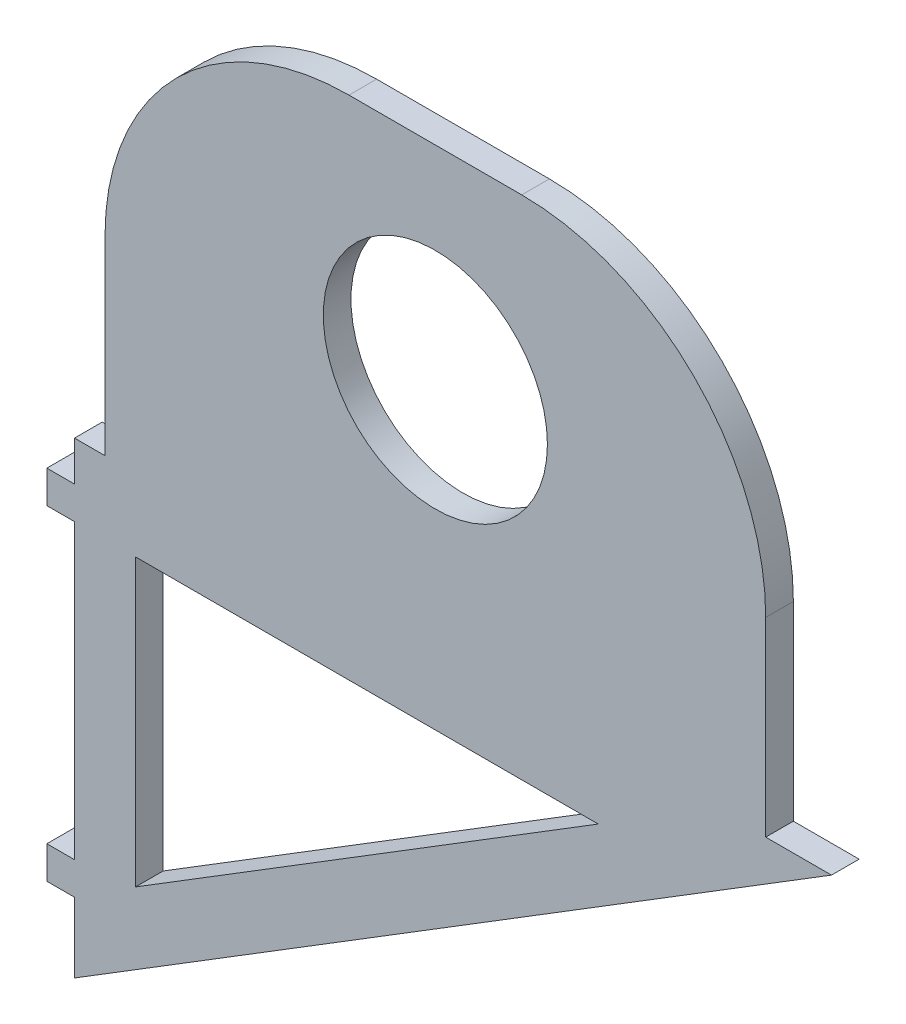
ISO-10303-21;
HEADER;
FILE_DESCRIPTION(('STEP AP214'),'2;1');
FILE_NAME('part.step','',(''),(''),'','','');
FILE_SCHEMA(('AUTOMOTIVE_DESIGN { 1 0 10303 214 1 1 1 1 }'));
ENDSEC;
DATA;
#1=APPLICATION_CONTEXT('core data for automotive mechanical design processes');
#2=APPLICATION_PROTOCOL_DEFINITION('international standard','automotive_design',2000,#1);
#3=PRODUCT_CONTEXT('',#1,'mechanical');
#4=PRODUCT('Part','Part','',(#3));
#5=PRODUCT_RELATED_PRODUCT_CATEGORY('part','',(#4));
#6=PRODUCT_DEFINITION_FORMATION('','',#4);
#7=PRODUCT_DEFINITION_CONTEXT('part definition',#1,'design');
#8=PRODUCT_DEFINITION('design','',#6,#7);
#9=PRODUCT_DEFINITION_SHAPE('','',#8);
#10=(LENGTH_UNIT() NAMED_UNIT(*) SI_UNIT(.MILLI.,.METRE.));
#11=(NAMED_UNIT(*) PLANE_ANGLE_UNIT() SI_UNIT($,.RADIAN.));
#12=(NAMED_UNIT(*) SI_UNIT($,.STERADIAN.) SOLID_ANGLE_UNIT());
#13=UNCERTAINTY_MEASURE_WITH_UNIT(LENGTH_MEASURE(1.E-05),#10,'distance_accuracy_value','');
#14=(GEOMETRIC_REPRESENTATION_CONTEXT(3) GLOBAL_UNCERTAINTY_ASSIGNED_CONTEXT((#13)) GLOBAL_UNIT_ASSIGNED_CONTEXT((#10,
#11,#12)) REPRESENTATION_CONTEXT('',''));
#15=CARTESIAN_POINT('',(0.,0.,0.));
#16=DIRECTION('',(0.,0.,1.));
#17=DIRECTION('',(1.,0.,0.));
#18=AXIS2_PLACEMENT_3D('',#15,#16,#17);
#19=CARTESIAN_POINT('',(4.06616211393135,2.51164702281581,1.7272));
#20=DIRECTION('',(-0.525522255598944,0.850779853352321,0.));
#21=DIRECTION('',(-0.850779853352322,-0.525522255598945,0.));
#22=AXIS2_PLACEMENT_3D('',#19,#20,#21);
#23=PLANE('',#22);
#24=DIRECTION('',(0.850779853352322,0.525522255598945,0.));
#25=VECTOR('',#24,1.);
#26=CARTESIAN_POINT('',(4.06616211393135,2.51164702281581,0.));
#27=LINE('',#26,#25);
#28=CARTESIAN_POINT('',(2.77555756156289E-13,0.,0.));
#29=VERTEX_POINT('',#28);
#30=CARTESIAN_POINT('',(47.2887289770404,29.21,0.));
#31=VERTEX_POINT('',#30);
#32=EDGE_CURVE('E249',#29,#31,#27,.T.);
#33=ORIENTED_EDGE('',*,*,#32,.T.);
#34=DIRECTION('',(0.,0.,-1.));
#35=VECTOR('',#34,1.);
#36=CARTESIAN_POINT('',(47.2887289770404,29.21,1.7272));
#37=LINE('',#36,#35);
#38=CARTESIAN_POINT('',(47.2887289770404,29.21,1.7272));
#39=VERTEX_POINT('',#38);
#40=EDGE_CURVE('E315',#39,#31,#37,.T.);
#41=ORIENTED_EDGE('',*,*,#40,.F.);
#42=DIRECTION('',(0.850779853352322,0.525522255598945,0.));
#43=VECTOR('',#42,1.);
#44=CARTESIAN_POINT('',(4.06616211393135,2.51164702281581,1.7272));
#45=LINE('',#44,#43);
#46=CARTESIAN_POINT('',(2.77555756156289E-13,0.,1.7272));
#47=VERTEX_POINT('',#46);
#48=EDGE_CURVE('E202',#47,#39,#45,.T.);
#49=ORIENTED_EDGE('',*,*,#48,.F.);
#50=DIRECTION('',(0.,0.,-1.));
#51=VECTOR('',#50,1.);
#52=CARTESIAN_POINT('',(2.77555756156289E-13,0.,1.7272));
#53=LINE('',#52,#51);
#54=EDGE_CURVE('E182',#47,#29,#53,.T.);
#55=ORIENTED_EDGE('',*,*,#54,.T.);
#56=EDGE_LOOP('',(#33,#41,#49,#55));
#57=FACE_BOUND('',#56,.T.);
#58=ADVANCED_FACE('F34',(#57),#23,.F.);
#59=CARTESIAN_POINT('',(23.6443644885204,29.21,1.7272));
#60=DIRECTION('',(0.,-1.,0.));
#61=DIRECTION('',(0.,0.,-1.));
#62=AXIS2_PLACEMENT_3D('',#59,#60,#61);
#63=PLANE('',#62);
#64=DIRECTION('',(-1.,0.,0.));
#65=VECTOR('',#64,1.);
#66=CARTESIAN_POINT('',(23.6443644885204,29.21,0.));
#67=LINE('',#66,#65);
#68=CARTESIAN_POINT('',(43.18,29.21,0.));
#69=VERTEX_POINT('',#68);
#70=EDGE_CURVE('E252',#31,#69,#67,.T.);
#71=ORIENTED_EDGE('',*,*,#70,.T.);
#72=DIRECTION('',(0.,0.,-1.));
#73=VECTOR('',#72,1.);
#74=CARTESIAN_POINT('',(43.18,29.21,1.7272));
#75=LINE('',#74,#73);
#76=CARTESIAN_POINT('',(43.18,29.21,1.7272));
#77=VERTEX_POINT('',#76);
#78=EDGE_CURVE('E312',#77,#69,#75,.T.);
#79=ORIENTED_EDGE('',*,*,#78,.F.);
#80=DIRECTION('',(-1.,0.,0.));
#81=VECTOR('',#80,1.);
#82=CARTESIAN_POINT('',(23.6443644885204,29.21,1.7272));
#83=LINE('',#82,#81);
#84=EDGE_CURVE('E205',#39,#77,#83,.T.);
#85=ORIENTED_EDGE('',*,*,#84,.F.);
#86=ORIENTED_EDGE('',*,*,#40,.T.);
#87=EDGE_LOOP('',(#71,#79,#85,#86));
#88=FACE_BOUND('',#87,.T.);
#89=ADVANCED_FACE('F354',(#88),#63,.F.);
#90=CARTESIAN_POINT('',(43.18,-29.1839471555335,1.7272));
#91=DIRECTION('',(-1.,0.,0.));
#92=DIRECTION('',(0.,0.,1.));
#93=AXIS2_PLACEMENT_3D('',#90,#91,#92);
#94=PLANE('',#93);
#95=DIRECTION('',(0.,1.,0.));
#96=VECTOR('',#95,1.);
#97=CARTESIAN_POINT('',(43.18,-29.1839471555335,0.));
#98=LINE('',#97,#96);
#99=CARTESIAN_POINT('',(43.18,41.0972000000001,0.));
#100=VERTEX_POINT('',#99);
#101=EDGE_CURVE('E254',#69,#100,#98,.T.);
#102=ORIENTED_EDGE('',*,*,#101,.T.);
#103=DIRECTION('',(0.,0.,-1.));
#104=VECTOR('',#103,1.);
#105=CARTESIAN_POINT('',(43.18,41.0972000000001,1.7272));
#106=LINE('',#105,#104);
#107=CARTESIAN_POINT('',(43.18,41.0972000000001,1.7272));
#108=VERTEX_POINT('',#107);
#109=EDGE_CURVE('E11',#100,#108,#106,.F.);
#110=ORIENTED_EDGE('',*,*,#109,.T.);
#111=DIRECTION('',(0.,1.,0.));
#112=VECTOR('',#111,1.);
#113=CARTESIAN_POINT('',(43.18,-29.1839471555335,1.7272));
#114=LINE('',#113,#112);
#115=EDGE_CURVE('E207',#77,#108,#114,.T.);
#116=ORIENTED_EDGE('',*,*,#115,.F.);
#117=ORIENTED_EDGE('',*,*,#78,.T.);
#118=EDGE_LOOP('',(#102,#110,#116,#117));
#119=FACE_BOUND('',#118,.T.);
#120=ADVANCED_FACE('F351',(#119),#94,.F.);
#121=CARTESIAN_POINT('',(23.6443644885201,56.3372000000001,1.7272));
#122=DIRECTION('',(0.,1.,0.));
#123=DIRECTION('',(-1.,0.,0.));
#124=AXIS2_PLACEMENT_3D('',#121,#122,#123);
#125=PLANE('',#124);
#126=DIRECTION('',(1.,0.,0.));
#127=VECTOR('',#126,1.);
#128=CARTESIAN_POINT('',(23.6443644885201,56.3372000000001,0.));
#129=LINE('',#128,#127);
#130=CARTESIAN_POINT('',(17.1449999999999,56.3372,0.));
#131=VERTEX_POINT('',#130);
#132=CARTESIAN_POINT('',(27.9399999999999,56.3372000000001,0.));
#133=VERTEX_POINT('',#132);
#134=EDGE_CURVE('E256',#131,#133,#129,.T.);
#135=ORIENTED_EDGE('',*,*,#134,.F.);
#136=DIRECTION('',(0.,0.,-1.));
#137=VECTOR('',#136,1.);
#138=CARTESIAN_POINT('',(17.1449999999999,56.3372,1.7272));
#139=LINE('',#138,#137);
#140=CARTESIAN_POINT('',(17.1449999999999,56.3372,1.7272));
#141=VERTEX_POINT('',#140);
#142=EDGE_CURVE('E330',#131,#141,#139,.F.);
#143=ORIENTED_EDGE('',*,*,#142,.T.);
#144=DIRECTION('',(1.,0.,0.));
#145=VECTOR('',#144,1.);
#146=CARTESIAN_POINT('',(23.6443644885201,56.3372000000001,1.7272));
#147=LINE('',#146,#145);
#148=CARTESIAN_POINT('',(27.9399999999999,56.3372000000001,1.7272));
#149=VERTEX_POINT('',#148);
#150=EDGE_CURVE('E209',#141,#149,#147,.T.);
#151=ORIENTED_EDGE('',*,*,#150,.T.);
#152=DIRECTION('',(0.,0.,-1.));
#153=VECTOR('',#152,1.);
#154=CARTESIAN_POINT('',(27.9399999999999,56.3372000000001,0.));
#155=LINE('',#154,#153);
#156=EDGE_CURVE('E327',#149,#133,#155,.T.);
#157=ORIENTED_EDGE('',*,*,#156,.T.);
#158=EDGE_LOOP('',(#135,#143,#151,#157));
#159=FACE_BOUND('',#158,.T.);
#160=ADVANCED_FACE('F347',(#159),#125,.T.);
#161=CARTESIAN_POINT('',(1.90499999999998,-29.1839471555335,1.7272));
#162=DIRECTION('',(-1.,0.,0.));
#163=DIRECTION('',(0.,0.,1.));
#164=AXIS2_PLACEMENT_3D('',#161,#162,#163);
#165=PLANE('',#164);
#166=DIRECTION('',(0.,1.,0.));
#167=VECTOR('',#166,1.);
#168=CARTESIAN_POINT('',(1.90499999999998,-29.1839471555335,1.7272));
#169=LINE('',#168,#167);
#170=CARTESIAN_POINT('',(1.90499999999998,29.21,1.7272));
#171=VERTEX_POINT('',#170);
#172=CARTESIAN_POINT('',(1.90499999999998,41.0972,1.7272));
#173=VERTEX_POINT('',#172);
#174=EDGE_CURVE('E211',#171,#173,#169,.T.);
#175=ORIENTED_EDGE('',*,*,#174,.T.);
#176=DIRECTION('',(0.,0.,-1.));
#177=VECTOR('',#176,1.);
#178=CARTESIAN_POINT('',(1.90499999999998,41.0972,1.7272));
#179=LINE('',#178,#177);
#180=CARTESIAN_POINT('',(1.90499999999998,41.0972,0.));
#181=VERTEX_POINT('',#180);
#182=EDGE_CURVE('E318',#173,#181,#179,.T.);
#183=ORIENTED_EDGE('',*,*,#182,.T.);
#184=DIRECTION('',(0.,1.,0.));
#185=VECTOR('',#184,1.);
#186=CARTESIAN_POINT('',(1.90499999999998,-29.1839471555335,0.));
#187=LINE('',#186,#185);
#188=CARTESIAN_POINT('',(1.90499999999998,29.21,0.));
#189=VERTEX_POINT('',#188);
#190=EDGE_CURVE('E259',#189,#181,#187,.T.);
#191=ORIENTED_EDGE('',*,*,#190,.F.);
#192=DIRECTION('',(0.,0.,-1.));
#193=VECTOR('',#192,1.);
#194=CARTESIAN_POINT('',(1.90499999999998,29.21,1.7272));
#195=LINE('',#194,#193);
#196=EDGE_CURVE('E310',#171,#189,#195,.T.);
#197=ORIENTED_EDGE('',*,*,#196,.F.);
#198=EDGE_LOOP('',(#175,#183,#191,#197));
#199=FACE_BOUND('',#198,.T.);
#200=ADVANCED_FACE('F338',(#199),#165,.T.);
#201=CARTESIAN_POINT('',(23.6443644885204,29.21,1.7272));
#202=DIRECTION('',(0.,-1.,0.));
#203=DIRECTION('',(0.,0.,-1.));
#204=AXIS2_PLACEMENT_3D('',#201,#202,#203);
#205=PLANE('',#204);
#206=DIRECTION('',(-1.,0.,0.));
#207=VECTOR('',#206,1.);
#208=CARTESIAN_POINT('',(23.6443644885204,29.21,0.));
#209=LINE('',#208,#207);
#210=CARTESIAN_POINT('',(2.77555756156289E-13,29.21,0.));
#211=VERTEX_POINT('',#210);
#212=EDGE_CURVE('E262',#189,#211,#209,.T.);
#213=ORIENTED_EDGE('',*,*,#212,.T.);
#214=DIRECTION('',(0.,0.,-1.));
#215=VECTOR('',#214,1.);
#216=CARTESIAN_POINT('',(2.77555756156289E-13,29.21,1.7272));
#217=LINE('',#216,#215);
#218=CARTESIAN_POINT('',(2.77555756156289E-13,29.21,1.7272));
#219=VERTEX_POINT('',#218);
#220=EDGE_CURVE('E308',#219,#211,#217,.T.);
#221=ORIENTED_EDGE('',*,*,#220,.F.);
#222=DIRECTION('',(-1.,0.,0.));
#223=VECTOR('',#222,1.);
#224=CARTESIAN_POINT('',(23.6443644885204,29.21,1.7272));
#225=LINE('',#224,#223);
#226=EDGE_CURVE('E214',#171,#219,#225,.T.);
#227=ORIENTED_EDGE('',*,*,#226,.F.);
#228=ORIENTED_EDGE('',*,*,#196,.T.);
#229=EDGE_LOOP('',(#213,#221,#227,#228));
#230=FACE_BOUND('',#229,.T.);
#231=ADVANCED_FACE('F401',(#230),#205,.F.);
#232=CARTESIAN_POINT('',(2.77555756156289E-13,-29.1839471555335,1.7272));
#233=DIRECTION('',(-1.,0.,0.));
#234=DIRECTION('',(0.,0.,1.));
#235=AXIS2_PLACEMENT_3D('',#232,#233,#234);
#236=PLANE('',#235);
#237=DIRECTION('',(0.,1.,0.));
#238=VECTOR('',#237,1.);
#239=CARTESIAN_POINT('',(2.77555756156289E-13,-29.1839471555335,0.));
#240=LINE('',#239,#238);
#241=CARTESIAN_POINT('',(2.77555756156289E-13,26.7208,0.));
#242=VERTEX_POINT('',#241);
#243=EDGE_CURVE('E265',#242,#211,#240,.T.);
#244=ORIENTED_EDGE('',*,*,#243,.F.);
#245=DIRECTION('',(0.,0.,-1.));
#246=VECTOR('',#245,1.);
#247=CARTESIAN_POINT('',(2.77555756156289E-13,26.7208,1.7272));
#248=LINE('',#247,#246);
#249=CARTESIAN_POINT('',(2.77555756156289E-13,26.7208,1.7272));
#250=VERTEX_POINT('',#249);
#251=EDGE_CURVE('E306',#250,#242,#248,.T.);
#252=ORIENTED_EDGE('',*,*,#251,.F.);
#253=DIRECTION('',(0.,1.,0.));
#254=VECTOR('',#253,1.);
#255=CARTESIAN_POINT('',(2.77555756156289E-13,-29.1839471555335,1.7272));
#256=LINE('',#255,#254);
#257=EDGE_CURVE('E216',#250,#219,#256,.T.);
#258=ORIENTED_EDGE('',*,*,#257,.T.);
#259=ORIENTED_EDGE('',*,*,#220,.T.);
#260=EDGE_LOOP('',(#244,#252,#258,#259));
#261=FACE_BOUND('',#260,.T.);
#262=ADVANCED_FACE('F398',(#261),#236,.T.);
#263=CARTESIAN_POINT('',(23.6443644885204,26.7208,1.7272));
#264=DIRECTION('',(0.,-1.,0.));
#265=DIRECTION('',(0.,0.,-1.));
#266=AXIS2_PLACEMENT_3D('',#263,#264,#265);
#267=PLANE('',#266);
#268=DIRECTION('',(-1.,0.,0.));
#269=VECTOR('',#268,1.);
#270=CARTESIAN_POINT('',(23.6443644885204,26.7208,0.));
#271=LINE('',#270,#269);
#272=CARTESIAN_POINT('',(-1.72719999999992,26.7208,0.));
#273=VERTEX_POINT('',#272);
#274=EDGE_CURVE('E268',#242,#273,#271,.T.);
#275=ORIENTED_EDGE('',*,*,#274,.T.);
#276=DIRECTION('',(0.,0.,-1.));
#277=VECTOR('',#276,1.);
#278=CARTESIAN_POINT('',(-1.72719999999992,26.7208,1.7272));
#279=LINE('',#278,#277);
#280=CARTESIAN_POINT('',(-1.72719999999992,26.7208,1.7272));
#281=VERTEX_POINT('',#280);
#282=EDGE_CURVE('E303',#281,#273,#279,.T.);
#283=ORIENTED_EDGE('',*,*,#282,.F.);
#284=DIRECTION('',(-1.,0.,0.));
#285=VECTOR('',#284,1.);
#286=CARTESIAN_POINT('',(23.6443644885204,26.7208,1.7272));
#287=LINE('',#286,#285);
#288=EDGE_CURVE('E219',#250,#281,#287,.T.);
#289=ORIENTED_EDGE('',*,*,#288,.F.);
#290=ORIENTED_EDGE('',*,*,#251,.T.);
#291=EDGE_LOOP('',(#275,#283,#289,#290));
#292=FACE_BOUND('',#291,.T.);
#293=ADVANCED_FACE('F394',(#292),#267,.F.);
#294=CARTESIAN_POINT('',(-1.72719999999992,-29.1839471555335,1.7272));
#295=DIRECTION('',(1.,0.,0.));
#296=DIRECTION('',(0.,0.,-1.));
#297=AXIS2_PLACEMENT_3D('',#294,#295,#296);
#298=PLANE('',#297);
#299=DIRECTION('',(0.,-1.,0.));
#300=VECTOR('',#299,1.);
#301=CARTESIAN_POINT('',(-1.72719999999992,-29.1839471555335,0.));
#302=LINE('',#301,#300);
#303=CARTESIAN_POINT('',(-1.72719999999992,24.6888,0.));
#304=VERTEX_POINT('',#303);
#305=EDGE_CURVE('E270',#273,#304,#302,.T.);
#306=ORIENTED_EDGE('',*,*,#305,.T.);
#307=DIRECTION('',(0.,0.,-1.));
#308=VECTOR('',#307,1.);
#309=CARTESIAN_POINT('',(-1.72719999999992,24.6888,1.7272));
#310=LINE('',#309,#308);
#311=CARTESIAN_POINT('',(-1.72719999999992,24.6888,1.7272));
#312=VERTEX_POINT('',#311);
#313=EDGE_CURVE('E301',#312,#304,#310,.T.);
#314=ORIENTED_EDGE('',*,*,#313,.F.);
#315=DIRECTION('',(0.,-1.,0.));
#316=VECTOR('',#315,1.);
#317=CARTESIAN_POINT('',(-1.72719999999992,-29.1839471555335,1.7272));
#318=LINE('',#317,#316);
#319=EDGE_CURVE('E221',#281,#312,#318,.T.);
#320=ORIENTED_EDGE('',*,*,#319,.F.);
#321=ORIENTED_EDGE('',*,*,#282,.T.);
#322=EDGE_LOOP('',(#306,#314,#320,#321));
#323=FACE_BOUND('',#322,.T.);
#324=ADVANCED_FACE('F390',(#323),#298,.F.);
#325=CARTESIAN_POINT('',(23.6443644885202,24.6888000000001,1.7272));
#326=DIRECTION('',(0.,-1.,0.));
#327=DIRECTION('',(1.,0.,0.));
#328=AXIS2_PLACEMENT_3D('',#325,#326,#327);
#329=PLANE('',#328);
#330=DIRECTION('',(-1.,0.,0.));
#331=VECTOR('',#330,1.);
#332=CARTESIAN_POINT('',(23.6443644885202,24.6888000000001,0.));
#333=LINE('',#332,#331);
#334=CARTESIAN_POINT('',(0.,24.6888,0.));
#335=VERTEX_POINT('',#334);
#336=EDGE_CURVE('E273',#335,#304,#333,.T.);
#337=ORIENTED_EDGE('',*,*,#336,.F.);
#338=DIRECTION('',(0.,0.,-1.));
#339=VECTOR('',#338,1.);
#340=CARTESIAN_POINT('',(0.,24.6888,1.7272));
#341=LINE('',#340,#339);
#342=CARTESIAN_POINT('',(0.,24.6888,1.7272));
#343=VERTEX_POINT('',#342);
#344=EDGE_CURVE('E299',#343,#335,#341,.T.);
#345=ORIENTED_EDGE('',*,*,#344,.F.);
#346=DIRECTION('',(-1.,0.,0.));
#347=VECTOR('',#346,1.);
#348=CARTESIAN_POINT('',(23.6443644885202,24.6888000000001,1.7272));
#349=LINE('',#348,#347);
#350=EDGE_CURVE('E223',#343,#312,#349,.T.);
#351=ORIENTED_EDGE('',*,*,#350,.T.);
#352=ORIENTED_EDGE('',*,*,#313,.T.);
#353=EDGE_LOOP('',(#337,#345,#351,#352));
#354=FACE_BOUND('',#353,.T.);
#355=ADVANCED_FACE('F385',(#354),#329,.T.);
#356=CARTESIAN_POINT('',(6.55725473919233E-13,-29.1839471555338,1.7272));
#357=DIRECTION('',(-1.,0.,0.));
#358=DIRECTION('',(0.,-1.,0.));
#359=AXIS2_PLACEMENT_3D('',#356,#357,#358);
#360=PLANE('',#359);
#361=DIRECTION('',(0.,1.,0.));
#362=VECTOR('',#361,1.);
#363=CARTESIAN_POINT('',(6.55725473919233E-13,-29.1839471555338,0.));
#364=LINE('',#363,#362);
#365=CARTESIAN_POINT('',(2.77555756156289E-13,6.40079999999999,0.));
#366=VERTEX_POINT('',#365);
#367=EDGE_CURVE('E276',#366,#335,#364,.T.);
#368=ORIENTED_EDGE('',*,*,#367,.F.);
#369=DIRECTION('',(0.,0.,-1.));
#370=VECTOR('',#369,1.);
#371=CARTESIAN_POINT('',(2.77555756156289E-13,6.40079999999999,1.7272));
#372=LINE('',#371,#370);
#373=CARTESIAN_POINT('',(2.77555756156289E-13,6.40079999999999,1.7272));
#374=VERTEX_POINT('',#373);
#375=EDGE_CURVE('E297',#374,#366,#372,.T.);
#376=ORIENTED_EDGE('',*,*,#375,.F.);
#377=DIRECTION('',(0.,1.,0.));
#378=VECTOR('',#377,1.);
#379=CARTESIAN_POINT('',(6.55725473919233E-13,-29.1839471555338,1.7272));
#380=LINE('',#379,#378);
#381=EDGE_CURVE('E226',#374,#343,#380,.T.);
#382=ORIENTED_EDGE('',*,*,#381,.T.);
#383=ORIENTED_EDGE('',*,*,#344,.T.);
#384=EDGE_LOOP('',(#368,#376,#382,#383));
#385=FACE_BOUND('',#384,.T.);
#386=ADVANCED_FACE('F380',(#385),#360,.T.);
#387=CARTESIAN_POINT('',(23.6443644885204,6.40079999999999,1.7272));
#388=DIRECTION('',(0.,-1.,0.));
#389=DIRECTION('',(0.,0.,-1.));
#390=AXIS2_PLACEMENT_3D('',#387,#388,#389);
#391=PLANE('',#390);
#392=DIRECTION('',(-1.,0.,0.));
#393=VECTOR('',#392,1.);
#394=CARTESIAN_POINT('',(23.6443644885204,6.40079999999999,0.));
#395=LINE('',#394,#393);
#396=CARTESIAN_POINT('',(-1.72719999999992,6.40079999999999,0.));
#397=VERTEX_POINT('',#396);
#398=EDGE_CURVE('E279',#366,#397,#395,.T.);
#399=ORIENTED_EDGE('',*,*,#398,.T.);
#400=DIRECTION('',(0.,0.,-1.));
#401=VECTOR('',#400,1.);
#402=CARTESIAN_POINT('',(-1.72719999999992,6.40079999999999,1.7272));
#403=LINE('',#402,#401);
#404=CARTESIAN_POINT('',(-1.72719999999992,6.40079999999999,1.7272));
#405=VERTEX_POINT('',#404);
#406=EDGE_CURVE('E294',#405,#397,#403,.T.);
#407=ORIENTED_EDGE('',*,*,#406,.F.);
#408=DIRECTION('',(-1.,0.,0.));
#409=VECTOR('',#408,1.);
#410=CARTESIAN_POINT('',(23.6443644885204,6.40079999999999,1.7272));
#411=LINE('',#410,#409);
#412=EDGE_CURVE('E229',#374,#405,#411,.T.);
#413=ORIENTED_EDGE('',*,*,#412,.F.);
#414=ORIENTED_EDGE('',*,*,#375,.T.);
#415=EDGE_LOOP('',(#399,#407,#413,#414));
#416=FACE_BOUND('',#415,.T.);
#417=ADVANCED_FACE('F377',(#416),#391,.F.);
#418=CARTESIAN_POINT('',(-1.72719999999992,-29.1839471555335,1.7272));
#419=DIRECTION('',(1.,0.,0.));
#420=DIRECTION('',(0.,0.,-1.));
#421=AXIS2_PLACEMENT_3D('',#418,#419,#420);
#422=PLANE('',#421);
#423=DIRECTION('',(0.,-1.,0.));
#424=VECTOR('',#423,1.);
#425=CARTESIAN_POINT('',(-1.72719999999992,-29.1839471555335,0.));
#426=LINE('',#425,#424);
#427=CARTESIAN_POINT('',(-1.72719999999992,4.3688,0.));
#428=VERTEX_POINT('',#427);
#429=EDGE_CURVE('E281',#397,#428,#426,.T.);
#430=ORIENTED_EDGE('',*,*,#429,.T.);
#431=DIRECTION('',(0.,0.,-1.));
#432=VECTOR('',#431,1.);
#433=CARTESIAN_POINT('',(-1.72719999999992,4.3688,1.7272));
#434=LINE('',#433,#432);
#435=CARTESIAN_POINT('',(-1.72719999999992,4.3688,1.7272));
#436=VERTEX_POINT('',#435);
#437=EDGE_CURVE('E292',#436,#428,#434,.T.);
#438=ORIENTED_EDGE('',*,*,#437,.F.);
#439=DIRECTION('',(0.,-1.,0.));
#440=VECTOR('',#439,1.);
#441=CARTESIAN_POINT('',(-1.72719999999992,-29.1839471555335,1.7272));
#442=LINE('',#441,#440);
#443=EDGE_CURVE('E231',#405,#436,#442,.T.);
#444=ORIENTED_EDGE('',*,*,#443,.F.);
#445=ORIENTED_EDGE('',*,*,#406,.T.);
#446=EDGE_LOOP('',(#430,#438,#444,#445));
#447=FACE_BOUND('',#446,.T.);
#448=ADVANCED_FACE('F372',(#447),#422,.F.);
#449=CARTESIAN_POINT('',(23.6443644885204,4.3688,1.7272));
#450=DIRECTION('',(0.,-1.,0.));
#451=DIRECTION('',(0.,0.,-1.));
#452=AXIS2_PLACEMENT_3D('',#449,#450,#451);
#453=PLANE('',#452);
#454=DIRECTION('',(-1.,0.,0.));
#455=VECTOR('',#454,1.);
#456=CARTESIAN_POINT('',(23.6443644885204,4.3688,0.));
#457=LINE('',#456,#455);
#458=CARTESIAN_POINT('',(2.77555756156289E-13,4.3688,0.));
#459=VERTEX_POINT('',#458);
#460=EDGE_CURVE('E284',#459,#428,#457,.T.);
#461=ORIENTED_EDGE('',*,*,#460,.F.);
#462=DIRECTION('',(0.,0.,-1.));
#463=VECTOR('',#462,1.);
#464=CARTESIAN_POINT('',(2.77555756156289E-13,4.3688,1.7272));
#465=LINE('',#464,#463);
#466=CARTESIAN_POINT('',(2.77555756156289E-13,4.3688,1.7272));
#467=VERTEX_POINT('',#466);
#468=EDGE_CURVE('E290',#467,#459,#465,.T.);
#469=ORIENTED_EDGE('',*,*,#468,.F.);
#470=DIRECTION('',(-1.,0.,0.));
#471=VECTOR('',#470,1.);
#472=CARTESIAN_POINT('',(23.6443644885204,4.3688,1.7272));
#473=LINE('',#472,#471);
#474=EDGE_CURVE('E233',#467,#436,#473,.T.);
#475=ORIENTED_EDGE('',*,*,#474,.T.);
#476=ORIENTED_EDGE('',*,*,#437,.T.);
#477=EDGE_LOOP('',(#461,#469,#475,#476));
#478=FACE_BOUND('',#477,.T.);
#479=ADVANCED_FACE('F366',(#478),#453,.T.);
#480=CARTESIAN_POINT('',(2.06392232009937,5.75311826408816,1.7272));
#481=DIRECTION('',(-0.525522255598944,0.850779853352321,0.));
#482=DIRECTION('',(-0.850779853352322,-0.525522255598945,0.));
#483=AXIS2_PLACEMENT_3D('',#480,#481,#482);
#484=PLANE('',#483);
#485=DIRECTION('',(0.850779853352322,0.525522255598944,0.));
#486=VECTOR('',#485,1.);
#487=CARTESIAN_POINT('',(2.06392232009937,5.75311826408816,0.));
#488=LINE('',#487,#486);
#489=CARTESIAN_POINT('',(3.81000000000028,6.83166129396465,0.));
#490=VERTEX_POINT('',#489);
#491=CARTESIAN_POINT('',(32.7193253192443,24.6888,0.));
#492=VERTEX_POINT('',#491);
#493=EDGE_CURVE('E178',#490,#492,#488,.T.);
#494=ORIENTED_EDGE('',*,*,#493,.F.);
#495=DIRECTION('',(0.,0.,-1.));
#496=VECTOR('',#495,1.);
#497=CARTESIAN_POINT('',(3.81000000000028,6.83166129396465,1.7272));
#498=LINE('',#497,#496);
#499=CARTESIAN_POINT('',(3.81000000000028,6.83166129396465,1.7272));
#500=VERTEX_POINT('',#499);
#501=EDGE_CURVE('E172',#500,#490,#498,.T.);
#502=ORIENTED_EDGE('',*,*,#501,.F.);
#503=DIRECTION('',(0.850779853352322,0.525522255598944,0.));
#504=VECTOR('',#503,1.);
#505=CARTESIAN_POINT('',(2.06392232009937,5.75311826408816,1.7272));
#506=LINE('',#505,#504);
#507=CARTESIAN_POINT('',(32.7193253192443,24.6888,1.7272));
#508=VERTEX_POINT('',#507);
#509=EDGE_CURVE('E176',#500,#508,#506,.T.);
#510=ORIENTED_EDGE('',*,*,#509,.T.);
#511=DIRECTION('',(0.,0.,-1.));
#512=VECTOR('',#511,1.);
#513=CARTESIAN_POINT('',(32.7193253192443,24.6888,1.7272));
#514=LINE('',#513,#512);
#515=EDGE_CURVE('E239',#508,#492,#514,.T.);
#516=ORIENTED_EDGE('',*,*,#515,.T.);
#517=EDGE_LOOP('',(#494,#502,#510,#516));
#518=FACE_BOUND('',#517,.T.);
#519=ADVANCED_FACE('F174',(#518),#484,.T.);
#520=CARTESIAN_POINT('',(3.81000000000028,-29.1839471555335,1.7272));
#521=DIRECTION('',(-1.,0.,0.));
#522=DIRECTION('',(0.,-1.,0.));
#523=AXIS2_PLACEMENT_3D('',#520,#521,#522);
#524=PLANE('',#523);
#525=DIRECTION('',(0.,1.,0.));
#526=VECTOR('',#525,1.);
#527=CARTESIAN_POINT('',(3.81000000000028,-29.1839471555335,0.));
#528=LINE('',#527,#526);
#529=CARTESIAN_POINT('',(3.81000000000028,24.6888,0.));
#530=VERTEX_POINT('',#529);
#531=EDGE_CURVE('E244',#490,#530,#528,.T.);
#532=ORIENTED_EDGE('',*,*,#531,.T.);
#533=DIRECTION('',(0.,0.,-1.));
#534=VECTOR('',#533,1.);
#535=CARTESIAN_POINT('',(3.81000000000028,24.6888,1.7272));
#536=LINE('',#535,#534);
#537=CARTESIAN_POINT('',(3.81000000000028,24.6888,1.7272));
#538=VERTEX_POINT('',#537);
#539=EDGE_CURVE('E183',#538,#530,#536,.T.);
#540=ORIENTED_EDGE('',*,*,#539,.F.);
#541=DIRECTION('',(0.,1.,0.));
#542=VECTOR('',#541,1.);
#543=CARTESIAN_POINT('',(3.81000000000028,-29.1839471555335,1.7272));
#544=LINE('',#543,#542);
#545=EDGE_CURVE('E187',#500,#538,#544,.T.);
#546=ORIENTED_EDGE('',*,*,#545,.F.);
#547=ORIENTED_EDGE('',*,*,#501,.T.);
#548=EDGE_LOOP('',(#532,#540,#546,#547));
#549=FACE_BOUND('',#548,.T.);
#550=ADVANCED_FACE('F188',(#549),#524,.F.);
#551=CARTESIAN_POINT('',(23.6443644885204,24.6888,1.7272));
#552=DIRECTION('',(0.,1.,0.));
#553=DIRECTION('',(0.,0.,1.));
#554=AXIS2_PLACEMENT_3D('',#551,#552,#553);
#555=PLANE('',#554);
#556=DIRECTION('',(1.,0.,0.));
#557=VECTOR('',#556,1.);
#558=CARTESIAN_POINT('',(23.6443644885204,24.6888,0.));
#559=LINE('',#558,#557);
#560=EDGE_CURVE('E246',#530,#492,#559,.T.);
#561=ORIENTED_EDGE('',*,*,#560,.T.);
#562=ORIENTED_EDGE('',*,*,#515,.F.);
#563=DIRECTION('',(1.,0.,0.));
#564=VECTOR('',#563,1.);
#565=CARTESIAN_POINT('',(23.6443644885204,24.6888,1.7272));
#566=LINE('',#565,#564);
#567=EDGE_CURVE('E191',#538,#508,#566,.T.);
#568=ORIENTED_EDGE('',*,*,#567,.F.);
#569=ORIENTED_EDGE('',*,*,#539,.T.);
#570=EDGE_LOOP('',(#561,#562,#568,#569));
#571=FACE_BOUND('',#570,.T.);
#572=ADVANCED_FACE('F410',(#571),#555,.F.);
#573=CARTESIAN_POINT('',(22.5425,43.6372,1.7272));
#574=DIRECTION('',(0.,0.,-1.));
#575=DIRECTION('',(-1.,0.,0.));
#576=AXIS2_PLACEMENT_3D('',#573,#574,#575);
#577=CYLINDRICAL_SURFACE('',#576,7.);
#578=CARTESIAN_POINT('',(22.5425,43.6372,1.7272));
#579=DIRECTION('',(0.,0.,1.));
#580=DIRECTION('',(1.,0.,0.));
#581=AXIS2_PLACEMENT_3D('',#578,#579,#580);
#582=CIRCLE('',#581,7.);
#583=CARTESIAN_POINT('',(29.5425,43.6372,1.7272));
#584=VERTEX_POINT('',#583);
#585=EDGE_CURVE('E195',#584,#584,#582,.T.);
#586=ORIENTED_EDGE('',*,*,#585,.T.);
#587=EDGE_LOOP('',(#586));
#588=FACE_BOUND('',#587,.T.);
#589=CARTESIAN_POINT('',(22.5425,43.6372,0.));
#590=DIRECTION('',(0.,0.,1.));
#591=DIRECTION('',(1.,0.,0.));
#592=AXIS2_PLACEMENT_3D('',#589,#590,#591);
#593=CIRCLE('',#592,7.);
#594=CARTESIAN_POINT('',(29.5425,43.6372,0.));
#595=VERTEX_POINT('',#594);
#596=EDGE_CURVE('E240',#595,#595,#593,.T.);
#597=ORIENTED_EDGE('',*,*,#596,.F.);
#598=EDGE_LOOP('',(#597));
#599=FACE_BOUND('',#598,.T.);
#600=ADVANCED_FACE('F413',(#588,#599),#577,.F.);
#601=CARTESIAN_POINT('',(2.77555756156289E-13,-29.1839471555335,1.7272));
#602=DIRECTION('',(-1.,0.,0.));
#603=DIRECTION('',(0.,0.,1.));
#604=AXIS2_PLACEMENT_3D('',#601,#602,#603);
#605=PLANE('',#604);
#606=DIRECTION('',(0.,1.,0.));
#607=VECTOR('',#606,1.);
#608=CARTESIAN_POINT('',(2.77555756156289E-13,-29.1839471555335,0.));
#609=LINE('',#608,#607);
#610=EDGE_CURVE('E198',#29,#459,#609,.T.);
#611=ORIENTED_EDGE('',*,*,#610,.F.);
#612=ORIENTED_EDGE('',*,*,#54,.F.);
#613=DIRECTION('',(0.,1.,0.));
#614=VECTOR('',#613,1.);
#615=CARTESIAN_POINT('',(2.77555756156289E-13,-29.1839471555335,1.7272));
#616=LINE('',#615,#614);
#617=EDGE_CURVE('E236',#47,#467,#616,.T.);
#618=ORIENTED_EDGE('',*,*,#617,.T.);
#619=ORIENTED_EDGE('',*,*,#468,.T.);
#620=EDGE_LOOP('',(#611,#612,#618,#619));
#621=FACE_BOUND('',#620,.T.);
#622=ADVANCED_FACE('F360',(#621),#605,.T.);
#623=CARTESIAN_POINT('',(23.6443644885204,-29.1839471555335,1.7272));
#624=DIRECTION('',(0.,0.,1.));
#625=DIRECTION('',(1.,0.,0.));
#626=AXIS2_PLACEMENT_3D('',#623,#624,#625);
#627=PLANE('',#626);
#628=ORIENTED_EDGE('',*,*,#585,.F.);
#629=EDGE_LOOP('',(#628));
#630=FACE_BOUND('',#629,.T.);
#631=ORIENTED_EDGE('',*,*,#509,.F.);
#632=ORIENTED_EDGE('',*,*,#545,.T.);
#633=ORIENTED_EDGE('',*,*,#567,.T.);
#634=EDGE_LOOP('',(#631,#632,#633));
#635=FACE_BOUND('',#634,.T.);
#636=ORIENTED_EDGE('',*,*,#150,.F.);
#637=CARTESIAN_POINT('',(17.145,41.0972,1.7272));
#638=DIRECTION('',(0.,0.,1.));
#639=DIRECTION('',(1.,0.,0.));
#640=AXIS2_PLACEMENT_3D('',#637,#638,#639);
#641=CIRCLE('',#640,15.24);
#642=EDGE_CURVE('E42',#141,#173,#641,.T.);
#643=ORIENTED_EDGE('',*,*,#642,.T.);
#644=ORIENTED_EDGE('',*,*,#174,.F.);
#645=ORIENTED_EDGE('',*,*,#226,.T.);
#646=ORIENTED_EDGE('',*,*,#257,.F.);
#647=ORIENTED_EDGE('',*,*,#288,.T.);
#648=ORIENTED_EDGE('',*,*,#319,.T.);
#649=ORIENTED_EDGE('',*,*,#350,.F.);
#650=ORIENTED_EDGE('',*,*,#381,.F.);
#651=ORIENTED_EDGE('',*,*,#412,.T.);
#652=ORIENTED_EDGE('',*,*,#443,.T.);
#653=ORIENTED_EDGE('',*,*,#474,.F.);
#654=ORIENTED_EDGE('',*,*,#617,.F.);
#655=ORIENTED_EDGE('',*,*,#48,.T.);
#656=ORIENTED_EDGE('',*,*,#84,.T.);
#657=ORIENTED_EDGE('',*,*,#115,.T.);
#658=CARTESIAN_POINT('',(27.94,41.0972000000001,1.7272));
#659=DIRECTION('',(0.,0.,1.));
#660=DIRECTION('',(1.,0.,0.));
#661=AXIS2_PLACEMENT_3D('',#658,#659,#660);
#662=CIRCLE('',#661,15.24);
#663=EDGE_CURVE('E54',#108,#149,#662,.T.);
#664=ORIENTED_EDGE('',*,*,#663,.T.);
#665=EDGE_LOOP('',(#636,#643,#644,#645,#646,#647,#648,#649,#650,#651,#652,#653,#654,#655,#656,
#657,#664));
#666=FACE_BOUND('',#665,.T.);
#667=ADVANCED_FACE('F193',(#630,#635,#666),#627,.T.);
#668=CARTESIAN_POINT('',(23.6443644885204,-29.1839471555335,0.));
#669=DIRECTION('',(0.,0.,1.));
#670=DIRECTION('',(1.,0.,0.));
#671=AXIS2_PLACEMENT_3D('',#668,#669,#670);
#672=PLANE('',#671);
#673=ORIENTED_EDGE('',*,*,#596,.T.);
#674=EDGE_LOOP('',(#673));
#675=FACE_BOUND('',#674,.T.);
#676=ORIENTED_EDGE('',*,*,#493,.T.);
#677=ORIENTED_EDGE('',*,*,#560,.F.);
#678=ORIENTED_EDGE('',*,*,#531,.F.);
#679=EDGE_LOOP('',(#676,#677,#678));
#680=FACE_BOUND('',#679,.T.);
#681=ORIENTED_EDGE('',*,*,#190,.T.);
#682=CARTESIAN_POINT('',(17.145,41.0972,0.));
#683=DIRECTION('',(0.,0.,1.));
#684=DIRECTION('',(1.,0.,0.));
#685=AXIS2_PLACEMENT_3D('',#682,#683,#684);
#686=CIRCLE('',#685,15.24);
#687=EDGE_CURVE('E325',#181,#131,#686,.F.);
#688=ORIENTED_EDGE('',*,*,#687,.T.);
#689=ORIENTED_EDGE('',*,*,#134,.T.);
#690=CARTESIAN_POINT('',(27.94,41.0972000000001,0.));
#691=DIRECTION('',(0.,0.,1.));
#692=DIRECTION('',(1.,0.,0.));
#693=AXIS2_PLACEMENT_3D('',#690,#691,#692);
#694=CIRCLE('',#693,15.24);
#695=EDGE_CURVE('E323',#133,#100,#694,.F.);
#696=ORIENTED_EDGE('',*,*,#695,.T.);
#697=ORIENTED_EDGE('',*,*,#101,.F.);
#698=ORIENTED_EDGE('',*,*,#70,.F.);
#699=ORIENTED_EDGE('',*,*,#32,.F.);
#700=ORIENTED_EDGE('',*,*,#610,.T.);
#701=ORIENTED_EDGE('',*,*,#460,.T.);
#702=ORIENTED_EDGE('',*,*,#429,.F.);
#703=ORIENTED_EDGE('',*,*,#398,.F.);
#704=ORIENTED_EDGE('',*,*,#367,.T.);
#705=ORIENTED_EDGE('',*,*,#336,.T.);
#706=ORIENTED_EDGE('',*,*,#305,.F.);
#707=ORIENTED_EDGE('',*,*,#274,.F.);
#708=ORIENTED_EDGE('',*,*,#243,.T.);
#709=ORIENTED_EDGE('',*,*,#212,.F.);
#710=EDGE_LOOP('',(#681,#688,#689,#696,#697,#698,#699,#700,#701,#702,#703,#704,#705,#706,#707,
#708,#709));
#711=FACE_BOUND('',#710,.T.);
#712=ADVANCED_FACE('F344',(#675,#680,#711),#672,.F.);
#713=CARTESIAN_POINT('',(17.145,41.0972,1.7272));
#714=DIRECTION('',(0.,0.,-1.));
#715=DIRECTION('',(-1.,0.,0.));
#716=AXIS2_PLACEMENT_3D('',#713,#714,#715);
#717=CYLINDRICAL_SURFACE('',#716,15.24);
#718=ORIENTED_EDGE('',*,*,#642,.F.);
#719=ORIENTED_EDGE('',*,*,#142,.F.);
#720=ORIENTED_EDGE('',*,*,#687,.F.);
#721=ORIENTED_EDGE('',*,*,#182,.F.);
#722=EDGE_LOOP('',(#718,#719,#720,#721));
#723=FACE_BOUND('',#722,.T.);
#724=ADVANCED_FACE('F341',(#723),#717,.T.);
#725=CARTESIAN_POINT('',(27.94,41.0972000000001,1.7272));
#726=DIRECTION('',(0.,0.,1.));
#727=DIRECTION('',(1.,0.,0.));
#728=AXIS2_PLACEMENT_3D('',#725,#726,#727);
#729=CYLINDRICAL_SURFACE('',#728,15.24);
#730=ORIENTED_EDGE('',*,*,#663,.F.);
#731=ORIENTED_EDGE('',*,*,#109,.F.);
#732=ORIENTED_EDGE('',*,*,#695,.F.);
#733=ORIENTED_EDGE('',*,*,#156,.F.);
#734=EDGE_LOOP('',(#730,#731,#732,#733));
#735=FACE_BOUND('',#734,.T.);
#736=ADVANCED_FACE('F36',(#735),#729,.T.);
#737=CLOSED_SHELL('',(#58,#89,#120,#160,#200,#231,#262,#293,#324,#355,#386,#417,#448,#479,#519,
#550,#572,#600,#622,#667,#712,#724,#736));
#738=MANIFOLD_SOLID_BREP('B2',#737);
#739=ADVANCED_BREP_SHAPE_REPRESENTATION('',(#18,#738),#14);
#740=SHAPE_DEFINITION_REPRESENTATION(#9,#739);
ENDSEC;
END-ISO-10303-21;
